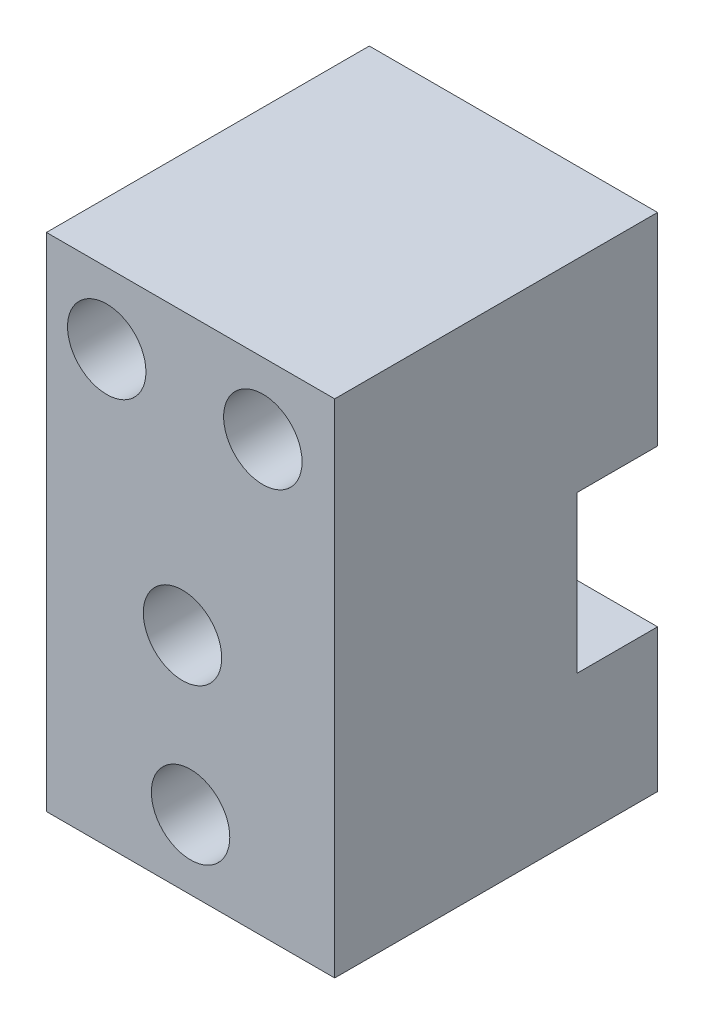
ISO-10303-21;
HEADER;
FILE_DESCRIPTION(('STEP AP214'),'2;1');
FILE_NAME('part.step','',(''),(''),'','','');
FILE_SCHEMA(('AUTOMOTIVE_DESIGN { 1 0 10303 214 1 1 1 1 }'));
ENDSEC;
DATA;
#1=APPLICATION_CONTEXT('core data for automotive mechanical design processes');
#2=APPLICATION_PROTOCOL_DEFINITION('international standard','automotive_design',2000,#1);
#3=PRODUCT_CONTEXT('',#1,'mechanical');
#4=PRODUCT('Part','Part','',(#3));
#5=PRODUCT_RELATED_PRODUCT_CATEGORY('part','',(#4));
#6=PRODUCT_DEFINITION_FORMATION('','',#4);
#7=PRODUCT_DEFINITION_CONTEXT('part definition',#1,'design');
#8=PRODUCT_DEFINITION('design','',#6,#7);
#9=PRODUCT_DEFINITION_SHAPE('','',#8);
#10=(LENGTH_UNIT() NAMED_UNIT(*) SI_UNIT(.MILLI.,.METRE.));
#11=(NAMED_UNIT(*) PLANE_ANGLE_UNIT() SI_UNIT($,.RADIAN.));
#12=(NAMED_UNIT(*) SI_UNIT($,.STERADIAN.) SOLID_ANGLE_UNIT());
#13=UNCERTAINTY_MEASURE_WITH_UNIT(LENGTH_MEASURE(1.E-05),#10,'distance_accuracy_value','');
#14=(GEOMETRIC_REPRESENTATION_CONTEXT(3) GLOBAL_UNCERTAINTY_ASSIGNED_CONTEXT((#13)) GLOBAL_UNIT_ASSIGNED_CONTEXT((#10,
#11,#12)) REPRESENTATION_CONTEXT('',''));
#15=CARTESIAN_POINT('',(0.,0.,0.));
#16=DIRECTION('',(0.,0.,1.));
#17=DIRECTION('',(1.,0.,0.));
#18=AXIS2_PLACEMENT_3D('',#15,#16,#17);
#19=CARTESIAN_POINT('',(6.25,-10.875,14.));
#20=DIRECTION('',(-1.,0.,0.));
#21=DIRECTION('',(0.,0.,1.));
#22=AXIS2_PLACEMENT_3D('',#19,#20,#21);
#23=PLANE('',#22);
#24=DIRECTION('',(0.,0.,-1.));
#25=VECTOR('',#24,1.);
#26=CARTESIAN_POINT('',(6.25,10.875,14.));
#27=LINE('',#26,#25);
#28=CARTESIAN_POINT('',(6.25,10.875,14.));
#29=VERTEX_POINT('',#28);
#30=CARTESIAN_POINT('',(6.25,10.875,0.));
#31=VERTEX_POINT('',#30);
#32=EDGE_CURVE('E11',#29,#31,#27,.T.);
#33=ORIENTED_EDGE('',*,*,#32,.F.);
#34=DIRECTION('',(0.,1.,0.));
#35=VECTOR('',#34,1.);
#36=CARTESIAN_POINT('',(6.25,-10.875,14.));
#37=LINE('',#36,#35);
#38=CARTESIAN_POINT('',(6.25,-10.875,14.));
#39=VERTEX_POINT('',#38);
#40=EDGE_CURVE('E87',#39,#29,#37,.T.);
#41=ORIENTED_EDGE('',*,*,#40,.F.);
#42=DIRECTION('',(0.,0.,-1.));
#43=VECTOR('',#42,1.);
#44=CARTESIAN_POINT('',(6.25,-10.875,14.));
#45=LINE('',#44,#43);
#46=CARTESIAN_POINT('',(6.25,-10.875,0.));
#47=VERTEX_POINT('',#46);
#48=EDGE_CURVE('E172',#39,#47,#45,.T.);
#49=ORIENTED_EDGE('',*,*,#48,.T.);
#50=DIRECTION('',(0.,1.,0.));
#51=VECTOR('',#50,1.);
#52=CARTESIAN_POINT('',(6.25,-10.875,0.));
#53=LINE('',#52,#51);
#54=CARTESIAN_POINT('',(6.25,-4.68628688192485,0.));
#55=VERTEX_POINT('',#54);
#56=EDGE_CURVE('E173',#47,#55,#53,.T.);
#57=ORIENTED_EDGE('',*,*,#56,.T.);
#58=DIRECTION('',(0.,0.,-1.));
#59=VECTOR('',#58,1.);
#60=CARTESIAN_POINT('',(6.25,-4.68628688192485,14.));
#61=LINE('',#60,#59);
#62=CARTESIAN_POINT('',(6.25,-4.68628688192485,3.5));
#63=VERTEX_POINT('',#62);
#64=EDGE_CURVE('E145',#63,#55,#61,.T.);
#65=ORIENTED_EDGE('',*,*,#64,.F.);
#66=DIRECTION('',(0.,-1.,0.));
#67=VECTOR('',#66,1.);
#68=CARTESIAN_POINT('',(6.25,-10.875,3.5));
#69=LINE('',#68,#67);
#70=CARTESIAN_POINT('',(6.25,2.10167556053342,3.5));
#71=VERTEX_POINT('',#70);
#72=EDGE_CURVE('E129',#71,#63,#69,.T.);
#73=ORIENTED_EDGE('',*,*,#72,.F.);
#74=DIRECTION('',(0.,0.,1.));
#75=VECTOR('',#74,1.);
#76=CARTESIAN_POINT('',(6.25,2.10167556053342,14.));
#77=LINE('',#76,#75);
#78=CARTESIAN_POINT('',(6.25,2.10167556053342,0.));
#79=VERTEX_POINT('',#78);
#80=EDGE_CURVE('E143',#79,#71,#77,.T.);
#81=ORIENTED_EDGE('',*,*,#80,.F.);
#82=EDGE_CURVE('E165',#79,#31,#53,.T.);
#83=ORIENTED_EDGE('',*,*,#82,.T.);
#84=EDGE_LOOP('',(#33,#41,#49,#57,#65,#73,#81,#83));
#85=FACE_BOUND('',#84,.T.);
#86=ADVANCED_FACE('F37',(#85),#23,.F.);
#87=CARTESIAN_POINT('',(0.,0.,0.));
#88=DIRECTION('',(0.,0.,-1.));
#89=DIRECTION('',(-1.,0.,0.));
#90=AXIS2_PLACEMENT_3D('',#87,#88,#89);
#91=PLANE('',#90);
#92=CARTESIAN_POINT('',(0.,-7.86581128851793,0.));
#93=DIRECTION('',(0.,0.,1.));
#94=DIRECTION('',(1.,0.,0.));
#95=AXIS2_PLACEMENT_3D('',#92,#93,#94);
#96=CIRCLE('',#95,1.7);
#97=CARTESIAN_POINT('',(1.7,-7.86581128851793,0.));
#98=VERTEX_POINT('',#97);
#99=EDGE_CURVE('E162',#98,#98,#96,.T.);
#100=ORIENTED_EDGE('',*,*,#99,.T.);
#101=EDGE_LOOP('',(#100));
#102=FACE_BOUND('',#101,.T.);
#103=CARTESIAN_POINT('',(3.13416826644808,7.79486728362855,0.));
#104=DIRECTION('',(0.,0.,1.));
#105=DIRECTION('',(1.,0.,0.));
#106=AXIS2_PLACEMENT_3D('',#103,#104,#105);
#107=CIRCLE('',#106,1.7);
#108=CARTESIAN_POINT('',(4.83416826644808,7.79486728362855,0.));
#109=VERTEX_POINT('',#108);
#110=EDGE_CURVE('E156',#109,#109,#107,.T.);
#111=ORIENTED_EDGE('',*,*,#110,.T.);
#112=EDGE_LOOP('',(#111));
#113=FACE_BOUND('',#112,.T.);
#114=CARTESIAN_POINT('',(-3.63556754034988,7.79486728362855,0.));
#115=DIRECTION('',(0.,0.,1.));
#116=DIRECTION('',(1.,0.,0.));
#117=AXIS2_PLACEMENT_3D('',#114,#115,#116);
#118=CIRCLE('',#117,1.7);
#119=CARTESIAN_POINT('',(-1.93556754034989,7.79486728362855,0.));
#120=VERTEX_POINT('',#119);
#121=EDGE_CURVE('E150',#120,#120,#118,.T.);
#122=ORIENTED_EDGE('',*,*,#121,.T.);
#123=EDGE_LOOP('',(#122));
#124=FACE_BOUND('',#123,.T.);
#125=DIRECTION('',(0.,-1.,0.));
#126=VECTOR('',#125,1.);
#127=CARTESIAN_POINT('',(-3.63556754034988,-4.68628688192485,0.));
#128=LINE('',#127,#126);
#129=CARTESIAN_POINT('',(-3.63556754034988,2.10167556053342,0.));
#130=VERTEX_POINT('',#129);
#131=CARTESIAN_POINT('',(-3.63556754034988,-4.68628688192485,0.));
#132=VERTEX_POINT('',#131);
#133=EDGE_CURVE('E133',#130,#132,#128,.T.);
#134=ORIENTED_EDGE('',*,*,#133,.T.);
#135=DIRECTION('',(1.,0.,0.));
#136=VECTOR('',#135,1.);
#137=CARTESIAN_POINT('',(-3.63556754034988,-4.68628688192485,0.));
#138=LINE('',#137,#136);
#139=EDGE_CURVE('E52',#132,#55,#138,.T.);
#140=ORIENTED_EDGE('',*,*,#139,.T.);
#141=ORIENTED_EDGE('',*,*,#56,.F.);
#142=DIRECTION('',(1.,0.,0.));
#143=VECTOR('',#142,1.);
#144=CARTESIAN_POINT('',(-6.25,-10.875,0.));
#145=LINE('',#144,#143);
#146=CARTESIAN_POINT('',(-6.25,-10.875,0.));
#147=VERTEX_POINT('',#146);
#148=EDGE_CURVE('E82',#147,#47,#145,.T.);
#149=ORIENTED_EDGE('',*,*,#148,.F.);
#150=DIRECTION('',(0.,-1.,0.));
#151=VECTOR('',#150,1.);
#152=CARTESIAN_POINT('',(-6.25,-10.875,0.));
#153=LINE('',#152,#151);
#154=CARTESIAN_POINT('',(-6.25,10.875,0.));
#155=VERTEX_POINT('',#154);
#156=EDGE_CURVE('E178',#155,#147,#153,.T.);
#157=ORIENTED_EDGE('',*,*,#156,.F.);
#158=DIRECTION('',(-1.,0.,0.));
#159=VECTOR('',#158,1.);
#160=CARTESIAN_POINT('',(-6.25,10.875,0.));
#161=LINE('',#160,#159);
#162=EDGE_CURVE('E176',#31,#155,#161,.T.);
#163=ORIENTED_EDGE('',*,*,#162,.F.);
#164=ORIENTED_EDGE('',*,*,#82,.F.);
#165=DIRECTION('',(-1.,0.,0.));
#166=VECTOR('',#165,1.);
#167=CARTESIAN_POINT('',(-3.63556754034988,2.10167556053342,0.));
#168=LINE('',#167,#166);
#169=EDGE_CURVE('E130',#79,#130,#168,.T.);
#170=ORIENTED_EDGE('',*,*,#169,.T.);
#171=EDGE_LOOP('',(#134,#140,#141,#149,#157,#163,#164,#170));
#172=FACE_BOUND('',#171,.T.);
#173=ADVANCED_FACE('F194',(#102,#113,#124,#172),#91,.T.);
#174=CARTESIAN_POINT('',(-0.349999999999997,-1.30616081776821,14.));
#175=DIRECTION('',(0.,0.,1.));
#176=DIRECTION('',(1.,0.,0.));
#177=AXIS2_PLACEMENT_3D('',#174,#175,#176);
#178=CYLINDRICAL_SURFACE('',#177,1.69999999999999);
#179=CARTESIAN_POINT('',(-0.349999999999997,-1.30616081776821,3.5));
#180=DIRECTION('',(0.,0.,-1.));
#181=DIRECTION('',(-1.,0.,0.));
#182=AXIS2_PLACEMENT_3D('',#179,#180,#181);
#183=CIRCLE('',#182,1.69999999999999);
#184=CARTESIAN_POINT('',(-2.04999999999999,-1.30616081776821,3.5));
#185=VERTEX_POINT('',#184);
#186=EDGE_CURVE('E40',#185,#185,#183,.F.);
#187=ORIENTED_EDGE('',*,*,#186,.F.);
#188=EDGE_LOOP('',(#187));
#189=FACE_BOUND('',#188,.T.);
#190=CARTESIAN_POINT('',(-0.349999999999997,-1.30616081776821,14.));
#191=DIRECTION('',(0.,0.,-1.));
#192=DIRECTION('',(-1.,0.,0.));
#193=AXIS2_PLACEMENT_3D('',#190,#191,#192);
#194=CIRCLE('',#193,1.69999999999999);
#195=CARTESIAN_POINT('',(-2.04999999999999,-1.30616081776821,14.));
#196=VERTEX_POINT('',#195);
#197=EDGE_CURVE('E136',#196,#196,#194,.F.);
#198=ORIENTED_EDGE('',*,*,#197,.T.);
#199=EDGE_LOOP('',(#198));
#200=FACE_BOUND('',#199,.T.);
#201=ADVANCED_FACE('F216',(#189,#200),#178,.F.);
#202=CARTESIAN_POINT('',(-6.25,10.875,14.));
#203=DIRECTION('',(0.,-1.,0.));
#204=DIRECTION('',(0.,0.,-1.));
#205=AXIS2_PLACEMENT_3D('',#202,#203,#204);
#206=PLANE('',#205);
#207=ORIENTED_EDGE('',*,*,#162,.T.);
#208=DIRECTION('',(0.,0.,-1.));
#209=VECTOR('',#208,1.);
#210=CARTESIAN_POINT('',(-6.25,10.875,14.));
#211=LINE('',#210,#209);
#212=CARTESIAN_POINT('',(-6.25,10.875,14.));
#213=VERTEX_POINT('',#212);
#214=EDGE_CURVE('E45',#213,#155,#211,.T.);
#215=ORIENTED_EDGE('',*,*,#214,.F.);
#216=DIRECTION('',(-1.,0.,0.));
#217=VECTOR('',#216,1.);
#218=CARTESIAN_POINT('',(-6.25,10.875,14.));
#219=LINE('',#218,#217);
#220=EDGE_CURVE('E167',#29,#213,#219,.T.);
#221=ORIENTED_EDGE('',*,*,#220,.F.);
#222=ORIENTED_EDGE('',*,*,#32,.T.);
#223=EDGE_LOOP('',(#207,#215,#221,#222));
#224=FACE_BOUND('',#223,.T.);
#225=ADVANCED_FACE('F209',(#224),#206,.F.);
#226=CARTESIAN_POINT('',(-6.25,-10.875,14.));
#227=DIRECTION('',(1.,0.,0.));
#228=DIRECTION('',(0.,0.,-1.));
#229=AXIS2_PLACEMENT_3D('',#226,#227,#228);
#230=PLANE('',#229);
#231=ORIENTED_EDGE('',*,*,#156,.T.);
#232=DIRECTION('',(0.,0.,-1.));
#233=VECTOR('',#232,1.);
#234=CARTESIAN_POINT('',(-6.25,-10.875,14.));
#235=LINE('',#234,#233);
#236=CARTESIAN_POINT('',(-6.25,-10.875,14.));
#237=VERTEX_POINT('',#236);
#238=EDGE_CURVE('E182',#237,#147,#235,.T.);
#239=ORIENTED_EDGE('',*,*,#238,.F.);
#240=DIRECTION('',(0.,-1.,0.));
#241=VECTOR('',#240,1.);
#242=CARTESIAN_POINT('',(-6.25,-10.875,14.));
#243=LINE('',#242,#241);
#244=EDGE_CURVE('E169',#213,#237,#243,.T.);
#245=ORIENTED_EDGE('',*,*,#244,.F.);
#246=ORIENTED_EDGE('',*,*,#214,.T.);
#247=EDGE_LOOP('',(#231,#239,#245,#246));
#248=FACE_BOUND('',#247,.T.);
#249=ADVANCED_FACE('F189',(#248),#230,.F.);
#250=CARTESIAN_POINT('',(-6.25,-10.875,14.));
#251=DIRECTION('',(0.,1.,0.));
#252=DIRECTION('',(0.,0.,1.));
#253=AXIS2_PLACEMENT_3D('',#250,#251,#252);
#254=PLANE('',#253);
#255=ORIENTED_EDGE('',*,*,#148,.T.);
#256=ORIENTED_EDGE('',*,*,#48,.F.);
#257=DIRECTION('',(1.,0.,0.));
#258=VECTOR('',#257,1.);
#259=CARTESIAN_POINT('',(-6.25,-10.875,14.));
#260=LINE('',#259,#258);
#261=EDGE_CURVE('E61',#237,#39,#260,.T.);
#262=ORIENTED_EDGE('',*,*,#261,.F.);
#263=ORIENTED_EDGE('',*,*,#238,.T.);
#264=EDGE_LOOP('',(#255,#256,#262,#263));
#265=FACE_BOUND('',#264,.T.);
#266=ADVANCED_FACE('F199',(#265),#254,.F.);
#267=CARTESIAN_POINT('',(0.,0.,14.));
#268=DIRECTION('',(0.,0.,-1.));
#269=DIRECTION('',(-1.,0.,0.));
#270=AXIS2_PLACEMENT_3D('',#267,#268,#269);
#271=PLANE('',#270);
#272=ORIENTED_EDGE('',*,*,#40,.T.);
#273=ORIENTED_EDGE('',*,*,#220,.T.);
#274=ORIENTED_EDGE('',*,*,#244,.T.);
#275=ORIENTED_EDGE('',*,*,#261,.T.);
#276=EDGE_LOOP('',(#272,#273,#274,#275));
#277=FACE_BOUND('',#276,.T.);
#278=CARTESIAN_POINT('',(-3.63556754034988,7.79486728362855,14.));
#279=DIRECTION('',(0.,0.,1.));
#280=DIRECTION('',(1.,0.,0.));
#281=AXIS2_PLACEMENT_3D('',#278,#279,#280);
#282=CIRCLE('',#281,1.7);
#283=CARTESIAN_POINT('',(-1.93556754034988,7.79486728362855,14.));
#284=VERTEX_POINT('',#283);
#285=EDGE_CURVE('E147',#284,#284,#282,.T.);
#286=ORIENTED_EDGE('',*,*,#285,.F.);
#287=EDGE_LOOP('',(#286));
#288=FACE_BOUND('',#287,.T.);
#289=CARTESIAN_POINT('',(3.13416826644808,7.79486728362855,14.));
#290=DIRECTION('',(0.,0.,1.));
#291=DIRECTION('',(1.,0.,0.));
#292=AXIS2_PLACEMENT_3D('',#289,#290,#291);
#293=CIRCLE('',#292,1.7);
#294=CARTESIAN_POINT('',(4.83416826644808,7.79486728362855,14.));
#295=VERTEX_POINT('',#294);
#296=EDGE_CURVE('E153',#295,#295,#293,.T.);
#297=ORIENTED_EDGE('',*,*,#296,.F.);
#298=EDGE_LOOP('',(#297));
#299=FACE_BOUND('',#298,.T.);
#300=CARTESIAN_POINT('',(0.,-7.86581128851793,14.));
#301=DIRECTION('',(0.,0.,1.));
#302=DIRECTION('',(1.,0.,0.));
#303=AXIS2_PLACEMENT_3D('',#300,#301,#302);
#304=CIRCLE('',#303,1.7);
#305=CARTESIAN_POINT('',(1.7,-7.86581128851793,14.));
#306=VERTEX_POINT('',#305);
#307=EDGE_CURVE('E159',#306,#306,#304,.T.);
#308=ORIENTED_EDGE('',*,*,#307,.F.);
#309=EDGE_LOOP('',(#308));
#310=FACE_BOUND('',#309,.T.);
#311=ORIENTED_EDGE('',*,*,#197,.F.);
#312=EDGE_LOOP('',(#311));
#313=FACE_BOUND('',#312,.T.);
#314=ADVANCED_FACE('F201',(#277,#288,#299,#310,#313),#271,.F.);
#315=CARTESIAN_POINT('',(0.,-7.86581128851793,14.));
#316=DIRECTION('',(0.,0.,1.));
#317=DIRECTION('',(1.,0.,0.));
#318=AXIS2_PLACEMENT_3D('',#315,#316,#317);
#319=CYLINDRICAL_SURFACE('',#318,1.7);
#320=ORIENTED_EDGE('',*,*,#99,.F.);
#321=EDGE_LOOP('',(#320));
#322=FACE_BOUND('',#321,.T.);
#323=ORIENTED_EDGE('',*,*,#307,.T.);
#324=EDGE_LOOP('',(#323));
#325=FACE_BOUND('',#324,.T.);
#326=ADVANCED_FACE('F207',(#322,#325),#319,.F.);
#327=CARTESIAN_POINT('',(3.13416826644808,7.79486728362855,14.));
#328=DIRECTION('',(0.,0.,1.));
#329=DIRECTION('',(1.,0.,0.));
#330=AXIS2_PLACEMENT_3D('',#327,#328,#329);
#331=CYLINDRICAL_SURFACE('',#330,1.7);
#332=ORIENTED_EDGE('',*,*,#110,.F.);
#333=EDGE_LOOP('',(#332));
#334=FACE_BOUND('',#333,.T.);
#335=ORIENTED_EDGE('',*,*,#296,.T.);
#336=EDGE_LOOP('',(#335));
#337=FACE_BOUND('',#336,.T.);
#338=ADVANCED_FACE('F227',(#334,#337),#331,.F.);
#339=CARTESIAN_POINT('',(-3.63556754034988,7.79486728362855,14.));
#340=DIRECTION('',(0.,0.,1.));
#341=DIRECTION('',(1.,0.,0.));
#342=AXIS2_PLACEMENT_3D('',#339,#340,#341);
#343=CYLINDRICAL_SURFACE('',#342,1.7);
#344=ORIENTED_EDGE('',*,*,#121,.F.);
#345=EDGE_LOOP('',(#344));
#346=FACE_BOUND('',#345,.T.);
#347=ORIENTED_EDGE('',*,*,#285,.T.);
#348=EDGE_LOOP('',(#347));
#349=FACE_BOUND('',#348,.T.);
#350=ADVANCED_FACE('F231',(#346,#349),#343,.F.);
#351=CARTESIAN_POINT('',(-3.63556754034988,-4.68628688192485,3.5));
#352=DIRECTION('',(0.,1.,0.));
#353=DIRECTION('',(-1.,0.,0.));
#354=AXIS2_PLACEMENT_3D('',#351,#352,#353);
#355=PLANE('',#354);
#356=ORIENTED_EDGE('',*,*,#64,.T.);
#357=ORIENTED_EDGE('',*,*,#139,.F.);
#358=DIRECTION('',(0.,0.,-1.));
#359=VECTOR('',#358,1.);
#360=CARTESIAN_POINT('',(-3.63556754034988,-4.68628688192485,3.5));
#361=LINE('',#360,#359);
#362=CARTESIAN_POINT('',(-3.63556754034988,-4.68628688192485,3.5));
#363=VERTEX_POINT('',#362);
#364=EDGE_CURVE('E114',#363,#132,#361,.T.);
#365=ORIENTED_EDGE('',*,*,#364,.F.);
#366=DIRECTION('',(1.,0.,0.));
#367=VECTOR('',#366,1.);
#368=CARTESIAN_POINT('',(-3.63556754034988,-4.68628688192485,3.5));
#369=LINE('',#368,#367);
#370=EDGE_CURVE('E121',#363,#63,#369,.T.);
#371=ORIENTED_EDGE('',*,*,#370,.T.);
#372=EDGE_LOOP('',(#356,#357,#365,#371));
#373=FACE_BOUND('',#372,.T.);
#374=ADVANCED_FACE('F124',(#373),#355,.T.);
#375=CARTESIAN_POINT('',(-3.63556754034988,2.10167556053342,3.5));
#376=DIRECTION('',(0.,-1.,0.));
#377=DIRECTION('',(1.,0.,0.));
#378=AXIS2_PLACEMENT_3D('',#375,#376,#377);
#379=PLANE('',#378);
#380=ORIENTED_EDGE('',*,*,#80,.T.);
#381=DIRECTION('',(-1.,0.,0.));
#382=VECTOR('',#381,1.);
#383=CARTESIAN_POINT('',(-3.63556754034988,2.10167556053342,3.5));
#384=LINE('',#383,#382);
#385=CARTESIAN_POINT('',(-3.63556754034988,2.10167556053342,3.5));
#386=VERTEX_POINT('',#385);
#387=EDGE_CURVE('E120',#71,#386,#384,.T.);
#388=ORIENTED_EDGE('',*,*,#387,.T.);
#389=DIRECTION('',(0.,0.,-1.));
#390=VECTOR('',#389,1.);
#391=CARTESIAN_POINT('',(-3.63556754034988,2.10167556053342,3.5));
#392=LINE('',#391,#390);
#393=EDGE_CURVE('E116',#386,#130,#392,.T.);
#394=ORIENTED_EDGE('',*,*,#393,.T.);
#395=ORIENTED_EDGE('',*,*,#169,.F.);
#396=EDGE_LOOP('',(#380,#388,#394,#395));
#397=FACE_BOUND('',#396,.T.);
#398=ADVANCED_FACE('F238',(#397),#379,.T.);
#399=CARTESIAN_POINT('',(0.,0.,3.5));
#400=DIRECTION('',(0.,0.,-1.));
#401=DIRECTION('',(1.,0.,0.));
#402=AXIS2_PLACEMENT_3D('',#399,#400,#401);
#403=PLANE('',#402);
#404=ORIENTED_EDGE('',*,*,#186,.T.);
#405=EDGE_LOOP('',(#404));
#406=FACE_BOUND('',#405,.T.);
#407=ORIENTED_EDGE('',*,*,#72,.T.);
#408=ORIENTED_EDGE('',*,*,#370,.F.);
#409=DIRECTION('',(0.,-1.,0.));
#410=VECTOR('',#409,1.);
#411=CARTESIAN_POINT('',(-3.63556754034988,-4.68628688192485,3.5));
#412=LINE('',#411,#410);
#413=EDGE_CURVE('E111',#386,#363,#412,.T.);
#414=ORIENTED_EDGE('',*,*,#413,.F.);
#415=ORIENTED_EDGE('',*,*,#387,.F.);
#416=EDGE_LOOP('',(#407,#408,#414,#415));
#417=FACE_BOUND('',#416,.T.);
#418=ADVANCED_FACE('F127',(#406,#417),#403,.T.);
#419=CARTESIAN_POINT('',(-3.63556754034988,-4.68628688192485,3.5));
#420=DIRECTION('',(1.,0.,0.));
#421=DIRECTION('',(0.,0.,-1.));
#422=AXIS2_PLACEMENT_3D('',#419,#420,#421);
#423=PLANE('',#422);
#424=ORIENTED_EDGE('',*,*,#133,.F.);
#425=ORIENTED_EDGE('',*,*,#393,.F.);
#426=ORIENTED_EDGE('',*,*,#413,.T.);
#427=ORIENTED_EDGE('',*,*,#364,.T.);
#428=EDGE_LOOP('',(#424,#425,#426,#427));
#429=FACE_BOUND('',#428,.T.);
#430=ADVANCED_FACE('F113',(#429),#423,.T.);
#431=CLOSED_SHELL('',(#86,#173,#201,#225,#249,#266,#314,#326,#338,#350,#374,#398,#418,#430));
#432=MANIFOLD_SOLID_BREP('B2',#431);
#433=ADVANCED_BREP_SHAPE_REPRESENTATION('',(#18,#432),#14);
#434=SHAPE_DEFINITION_REPRESENTATION(#9,#433);
ENDSEC;
END-ISO-10303-21;
